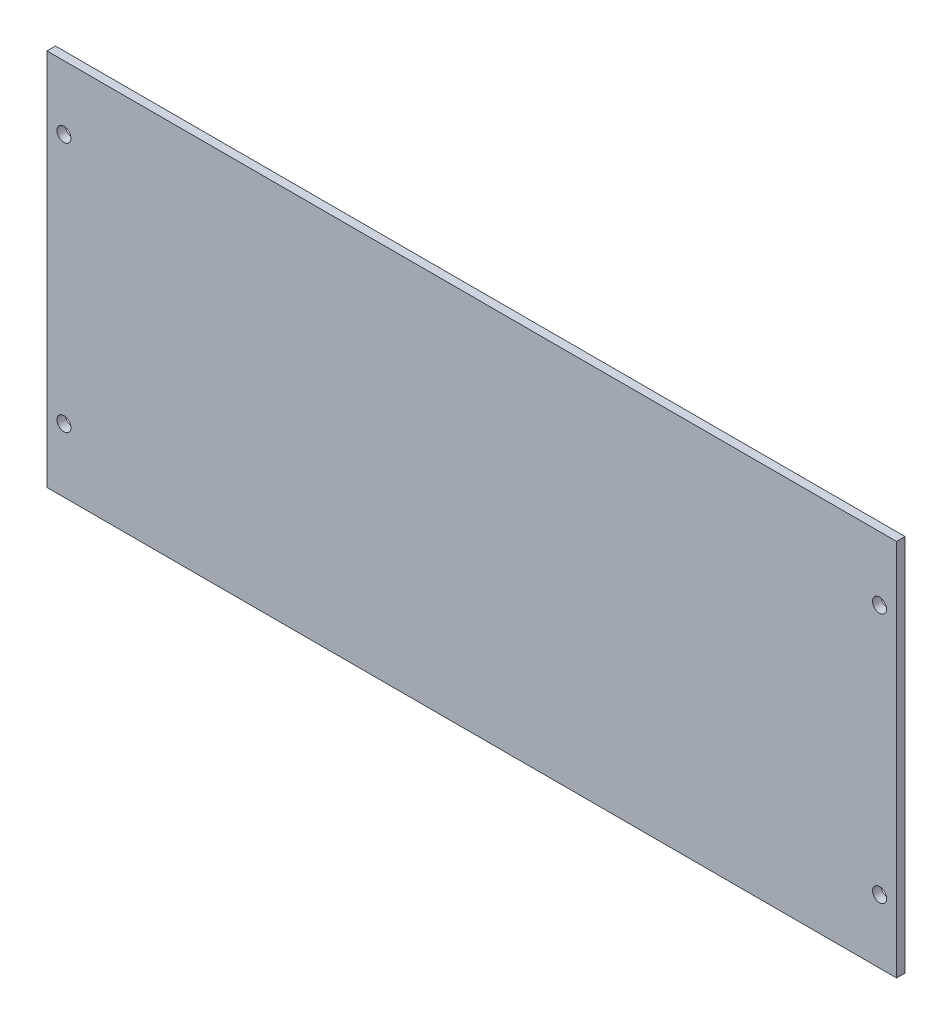
ISO-10303-21;
HEADER;
FILE_DESCRIPTION(('STEP AP214'),'2;1');
FILE_NAME('part.step','',(''),(''),'','','');
FILE_SCHEMA(('AUTOMOTIVE_DESIGN { 1 0 10303 214 1 1 1 1 }'));
ENDSEC;
DATA;
#1=APPLICATION_CONTEXT('core data for automotive mechanical design processes');
#2=APPLICATION_PROTOCOL_DEFINITION('international standard','automotive_design',2000,#1);
#3=PRODUCT_CONTEXT('',#1,'mechanical');
#4=PRODUCT('Part','Part','',(#3));
#5=PRODUCT_RELATED_PRODUCT_CATEGORY('part','',(#4));
#6=PRODUCT_DEFINITION_FORMATION('','',#4);
#7=PRODUCT_DEFINITION_CONTEXT('part definition',#1,'design');
#8=PRODUCT_DEFINITION('design','',#6,#7);
#9=PRODUCT_DEFINITION_SHAPE('','',#8);
#10=(LENGTH_UNIT() NAMED_UNIT(*) SI_UNIT(.MILLI.,.METRE.));
#11=(NAMED_UNIT(*) PLANE_ANGLE_UNIT() SI_UNIT($,.RADIAN.));
#12=(NAMED_UNIT(*) SI_UNIT($,.STERADIAN.) SOLID_ANGLE_UNIT());
#13=UNCERTAINTY_MEASURE_WITH_UNIT(LENGTH_MEASURE(1.E-05),#10,'distance_accuracy_value','');
#14=(GEOMETRIC_REPRESENTATION_CONTEXT(3) GLOBAL_UNCERTAINTY_ASSIGNED_CONTEXT((#13)) GLOBAL_UNIT_ASSIGNED_CONTEXT((#10,
#11,#12)) REPRESENTATION_CONTEXT('',''));
#15=CARTESIAN_POINT('',(0.,0.,0.));
#16=DIRECTION('',(0.,0.,1.));
#17=DIRECTION('',(1.,0.,0.));
#18=AXIS2_PLACEMENT_3D('',#15,#16,#17);
#19=CARTESIAN_POINT('',(200.,-89.,4.));
#20=DIRECTION('',(-1.,0.,0.));
#21=DIRECTION('',(0.,0.,1.));
#22=AXIS2_PLACEMENT_3D('',#19,#20,#21);
#23=PLANE('',#22);
#24=DIRECTION('',(0.,1.,0.));
#25=VECTOR('',#24,1.);
#26=CARTESIAN_POINT('',(200.,-89.,0.));
#27=LINE('',#26,#25);
#28=CARTESIAN_POINT('',(200.,-89.,0.));
#29=VERTEX_POINT('',#28);
#30=CARTESIAN_POINT('',(200.,89.,0.));
#31=VERTEX_POINT('',#30);
#32=EDGE_CURVE('E95',#29,#31,#27,.T.);
#33=ORIENTED_EDGE('',*,*,#32,.T.);
#34=DIRECTION('',(0.,0.,-1.));
#35=VECTOR('',#34,1.);
#36=CARTESIAN_POINT('',(200.,89.,4.));
#37=LINE('',#36,#35);
#38=CARTESIAN_POINT('',(200.,89.,4.));
#39=VERTEX_POINT('',#38);
#40=EDGE_CURVE('E11',#39,#31,#37,.T.);
#41=ORIENTED_EDGE('',*,*,#40,.F.);
#42=DIRECTION('',(0.,1.,0.));
#43=VECTOR('',#42,1.);
#44=CARTESIAN_POINT('',(200.,-89.,4.));
#45=LINE('',#44,#43);
#46=CARTESIAN_POINT('',(200.,-89.,4.));
#47=VERTEX_POINT('',#46);
#48=EDGE_CURVE('E83',#47,#39,#45,.T.);
#49=ORIENTED_EDGE('',*,*,#48,.F.);
#50=DIRECTION('',(0.,0.,-1.));
#51=VECTOR('',#50,1.);
#52=CARTESIAN_POINT('',(200.,-89.,4.));
#53=LINE('',#52,#51);
#54=EDGE_CURVE('E91',#47,#29,#53,.T.);
#55=ORIENTED_EDGE('',*,*,#54,.T.);
#56=EDGE_LOOP('',(#33,#41,#49,#55));
#57=FACE_BOUND('',#56,.T.);
#58=ADVANCED_FACE('F32',(#57),#23,.F.);
#59=CARTESIAN_POINT('',(-200.,89.,4.));
#60=DIRECTION('',(0.,-1.,0.));
#61=DIRECTION('',(0.,0.,-1.));
#62=AXIS2_PLACEMENT_3D('',#59,#60,#61);
#63=PLANE('',#62);
#64=DIRECTION('',(-1.,0.,0.));
#65=VECTOR('',#64,1.);
#66=CARTESIAN_POINT('',(-200.,89.,0.));
#67=LINE('',#66,#65);
#68=CARTESIAN_POINT('',(-200.,89.,0.));
#69=VERTEX_POINT('',#68);
#70=EDGE_CURVE('E87',#31,#69,#67,.T.);
#71=ORIENTED_EDGE('',*,*,#70,.T.);
#72=DIRECTION('',(0.,0.,-1.));
#73=VECTOR('',#72,1.);
#74=CARTESIAN_POINT('',(-200.,89.,4.));
#75=LINE('',#74,#73);
#76=CARTESIAN_POINT('',(-200.,89.,4.));
#77=VERTEX_POINT('',#76);
#78=EDGE_CURVE('E40',#77,#69,#75,.T.);
#79=ORIENTED_EDGE('',*,*,#78,.F.);
#80=DIRECTION('',(-1.,0.,0.));
#81=VECTOR('',#80,1.);
#82=CARTESIAN_POINT('',(-200.,89.,4.));
#83=LINE('',#82,#81);
#84=EDGE_CURVE('E78',#39,#77,#83,.T.);
#85=ORIENTED_EDGE('',*,*,#84,.F.);
#86=ORIENTED_EDGE('',*,*,#40,.T.);
#87=EDGE_LOOP('',(#71,#79,#85,#86));
#88=FACE_BOUND('',#87,.T.);
#89=ADVANCED_FACE('F86',(#88),#63,.F.);
#90=CARTESIAN_POINT('',(-200.,-89.,4.));
#91=DIRECTION('',(1.,0.,0.));
#92=DIRECTION('',(0.,0.,-1.));
#93=AXIS2_PLACEMENT_3D('',#90,#91,#92);
#94=PLANE('',#93);
#95=DIRECTION('',(0.,-1.,0.));
#96=VECTOR('',#95,1.);
#97=CARTESIAN_POINT('',(-200.,-89.,0.));
#98=LINE('',#97,#96);
#99=CARTESIAN_POINT('',(-200.,-89.,0.));
#100=VERTEX_POINT('',#99);
#101=EDGE_CURVE('E65',#69,#100,#98,.T.);
#102=ORIENTED_EDGE('',*,*,#101,.T.);
#103=DIRECTION('',(0.,0.,-1.));
#104=VECTOR('',#103,1.);
#105=CARTESIAN_POINT('',(-200.,-89.,4.));
#106=LINE('',#105,#104);
#107=CARTESIAN_POINT('',(-200.,-89.,4.));
#108=VERTEX_POINT('',#107);
#109=EDGE_CURVE('E88',#108,#100,#106,.T.);
#110=ORIENTED_EDGE('',*,*,#109,.F.);
#111=DIRECTION('',(0.,-1.,0.));
#112=VECTOR('',#111,1.);
#113=CARTESIAN_POINT('',(-200.,-89.,4.));
#114=LINE('',#113,#112);
#115=EDGE_CURVE('E81',#77,#108,#114,.T.);
#116=ORIENTED_EDGE('',*,*,#115,.F.);
#117=ORIENTED_EDGE('',*,*,#78,.T.);
#118=EDGE_LOOP('',(#102,#110,#116,#117));
#119=FACE_BOUND('',#118,.T.);
#120=ADVANCED_FACE('F89',(#119),#94,.F.);
#121=CARTESIAN_POINT('',(-200.,-89.,4.));
#122=DIRECTION('',(0.,1.,0.));
#123=DIRECTION('',(0.,0.,1.));
#124=AXIS2_PLACEMENT_3D('',#121,#122,#123);
#125=PLANE('',#124);
#126=DIRECTION('',(1.,0.,0.));
#127=VECTOR('',#126,1.);
#128=CARTESIAN_POINT('',(-200.,-89.,0.));
#129=LINE('',#128,#127);
#130=EDGE_CURVE('E71',#100,#29,#129,.T.);
#131=ORIENTED_EDGE('',*,*,#130,.T.);
#132=ORIENTED_EDGE('',*,*,#54,.F.);
#133=DIRECTION('',(1.,0.,0.));
#134=VECTOR('',#133,1.);
#135=CARTESIAN_POINT('',(-200.,-89.,4.));
#136=LINE('',#135,#134);
#137=EDGE_CURVE('E48',#108,#47,#136,.T.);
#138=ORIENTED_EDGE('',*,*,#137,.F.);
#139=ORIENTED_EDGE('',*,*,#109,.T.);
#140=EDGE_LOOP('',(#131,#132,#138,#139));
#141=FACE_BOUND('',#140,.T.);
#142=ADVANCED_FACE('F103',(#141),#125,.F.);
#143=CARTESIAN_POINT('',(0.,0.,4.));
#144=DIRECTION('',(0.,0.,-1.));
#145=DIRECTION('',(-1.,0.,0.));
#146=AXIS2_PLACEMENT_3D('',#143,#144,#145);
#147=PLANE('',#146);
#148=CARTESIAN_POINT('',(-192.,59.,4.));
#149=DIRECTION('',(0.,0.,-1.));
#150=DIRECTION('',(-1.,0.,0.));
#151=AXIS2_PLACEMENT_3D('',#148,#149,#150);
#152=CIRCLE('',#151,3.3);
#153=CARTESIAN_POINT('',(-195.3,59.,4.));
#154=VERTEX_POINT('',#153);
#155=EDGE_CURVE('E126',#154,#154,#152,.T.);
#156=ORIENTED_EDGE('',*,*,#155,.T.);
#157=EDGE_LOOP('',(#156));
#158=FACE_BOUND('',#157,.T.);
#159=CARTESIAN_POINT('',(-192.,-59.,4.));
#160=DIRECTION('',(0.,0.,-1.));
#161=DIRECTION('',(-1.,0.,0.));
#162=AXIS2_PLACEMENT_3D('',#159,#160,#161);
#163=CIRCLE('',#162,3.3);
#164=CARTESIAN_POINT('',(-195.3,-59.,4.));
#165=VERTEX_POINT('',#164);
#166=EDGE_CURVE('E120',#165,#165,#163,.T.);
#167=ORIENTED_EDGE('',*,*,#166,.T.);
#168=EDGE_LOOP('',(#167));
#169=FACE_BOUND('',#168,.T.);
#170=CARTESIAN_POINT('',(192.,-59.,4.));
#171=DIRECTION('',(0.,0.,-1.));
#172=DIRECTION('',(-1.,0.,0.));
#173=AXIS2_PLACEMENT_3D('',#170,#171,#172);
#174=CIRCLE('',#173,3.3);
#175=CARTESIAN_POINT('',(188.7,-59.,4.));
#176=VERTEX_POINT('',#175);
#177=EDGE_CURVE('E114',#176,#176,#174,.T.);
#178=ORIENTED_EDGE('',*,*,#177,.T.);
#179=EDGE_LOOP('',(#178));
#180=FACE_BOUND('',#179,.T.);
#181=CARTESIAN_POINT('',(192.,59.,4.));
#182=DIRECTION('',(0.,0.,-1.));
#183=DIRECTION('',(-1.,0.,0.));
#184=AXIS2_PLACEMENT_3D('',#181,#182,#183);
#185=CIRCLE('',#184,3.3);
#186=CARTESIAN_POINT('',(188.7,59.,4.));
#187=VERTEX_POINT('',#186);
#188=EDGE_CURVE('E98',#187,#187,#185,.T.);
#189=ORIENTED_EDGE('',*,*,#188,.T.);
#190=EDGE_LOOP('',(#189));
#191=FACE_BOUND('',#190,.T.);
#192=ORIENTED_EDGE('',*,*,#48,.T.);
#193=ORIENTED_EDGE('',*,*,#84,.T.);
#194=ORIENTED_EDGE('',*,*,#115,.T.);
#195=ORIENTED_EDGE('',*,*,#137,.T.);
#196=EDGE_LOOP('',(#192,#193,#194,#195));
#197=FACE_BOUND('',#196,.T.);
#198=ADVANCED_FACE('F79',(#158,#169,#180,#191,#197),#147,.F.);
#199=CARTESIAN_POINT('',(0.,0.,0.));
#200=DIRECTION('',(0.,0.,-1.));
#201=DIRECTION('',(-1.,0.,0.));
#202=AXIS2_PLACEMENT_3D('',#199,#200,#201);
#203=PLANE('',#202);
#204=CARTESIAN_POINT('',(-192.,59.,0.));
#205=DIRECTION('',(0.,0.,-1.));
#206=DIRECTION('',(-1.,0.,0.));
#207=AXIS2_PLACEMENT_3D('',#204,#205,#206);
#208=CIRCLE('',#207,3.3);
#209=CARTESIAN_POINT('',(-195.3,59.,0.));
#210=VERTEX_POINT('',#209);
#211=EDGE_CURVE('E129',#210,#210,#208,.T.);
#212=ORIENTED_EDGE('',*,*,#211,.F.);
#213=EDGE_LOOP('',(#212));
#214=FACE_BOUND('',#213,.T.);
#215=CARTESIAN_POINT('',(-192.,-59.,0.));
#216=DIRECTION('',(0.,0.,-1.));
#217=DIRECTION('',(-1.,0.,0.));
#218=AXIS2_PLACEMENT_3D('',#215,#216,#217);
#219=CIRCLE('',#218,3.3);
#220=CARTESIAN_POINT('',(-195.3,-59.,0.));
#221=VERTEX_POINT('',#220);
#222=EDGE_CURVE('E123',#221,#221,#219,.T.);
#223=ORIENTED_EDGE('',*,*,#222,.F.);
#224=EDGE_LOOP('',(#223));
#225=FACE_BOUND('',#224,.T.);
#226=CARTESIAN_POINT('',(192.,-59.,0.));
#227=DIRECTION('',(0.,0.,-1.));
#228=DIRECTION('',(-1.,0.,0.));
#229=AXIS2_PLACEMENT_3D('',#226,#227,#228);
#230=CIRCLE('',#229,3.3);
#231=CARTESIAN_POINT('',(188.7,-59.,0.));
#232=VERTEX_POINT('',#231);
#233=EDGE_CURVE('E117',#232,#232,#230,.T.);
#234=ORIENTED_EDGE('',*,*,#233,.F.);
#235=EDGE_LOOP('',(#234));
#236=FACE_BOUND('',#235,.T.);
#237=CARTESIAN_POINT('',(192.,59.,0.));
#238=DIRECTION('',(0.,0.,-1.));
#239=DIRECTION('',(-1.,0.,0.));
#240=AXIS2_PLACEMENT_3D('',#237,#238,#239);
#241=CIRCLE('',#240,3.3);
#242=CARTESIAN_POINT('',(188.7,59.,0.));
#243=VERTEX_POINT('',#242);
#244=EDGE_CURVE('E111',#243,#243,#241,.T.);
#245=ORIENTED_EDGE('',*,*,#244,.F.);
#246=EDGE_LOOP('',(#245));
#247=FACE_BOUND('',#246,.T.);
#248=ORIENTED_EDGE('',*,*,#32,.F.);
#249=ORIENTED_EDGE('',*,*,#130,.F.);
#250=ORIENTED_EDGE('',*,*,#101,.F.);
#251=ORIENTED_EDGE('',*,*,#70,.F.);
#252=EDGE_LOOP('',(#248,#249,#250,#251));
#253=FACE_BOUND('',#252,.T.);
#254=ADVANCED_FACE('F106',(#214,#225,#236,#247,#253),#203,.T.);
#255=CARTESIAN_POINT('',(192.,59.,0.));
#256=DIRECTION('',(0.,0.,-1.));
#257=DIRECTION('',(-1.,0.,0.));
#258=AXIS2_PLACEMENT_3D('',#255,#256,#257);
#259=CYLINDRICAL_SURFACE('',#258,3.3);
#260=ORIENTED_EDGE('',*,*,#188,.F.);
#261=EDGE_LOOP('',(#260));
#262=FACE_BOUND('',#261,.T.);
#263=ORIENTED_EDGE('',*,*,#244,.T.);
#264=EDGE_LOOP('',(#263));
#265=FACE_BOUND('',#264,.T.);
#266=ADVANCED_FACE('F137',(#262,#265),#259,.F.);
#267=CARTESIAN_POINT('',(192.,-59.,0.));
#268=DIRECTION('',(0.,0.,-1.));
#269=DIRECTION('',(-1.,0.,0.));
#270=AXIS2_PLACEMENT_3D('',#267,#268,#269);
#271=CYLINDRICAL_SURFACE('',#270,3.3);
#272=ORIENTED_EDGE('',*,*,#177,.F.);
#273=EDGE_LOOP('',(#272));
#274=FACE_BOUND('',#273,.T.);
#275=ORIENTED_EDGE('',*,*,#233,.T.);
#276=EDGE_LOOP('',(#275));
#277=FACE_BOUND('',#276,.T.);
#278=ADVANCED_FACE('F146',(#274,#277),#271,.F.);
#279=CARTESIAN_POINT('',(-192.,-59.,0.));
#280=DIRECTION('',(0.,0.,-1.));
#281=DIRECTION('',(-1.,0.,0.));
#282=AXIS2_PLACEMENT_3D('',#279,#280,#281);
#283=CYLINDRICAL_SURFACE('',#282,3.3);
#284=ORIENTED_EDGE('',*,*,#166,.F.);
#285=EDGE_LOOP('',(#284));
#286=FACE_BOUND('',#285,.T.);
#287=ORIENTED_EDGE('',*,*,#222,.T.);
#288=EDGE_LOOP('',(#287));
#289=FACE_BOUND('',#288,.T.);
#290=ADVANCED_FACE('F152',(#286,#289),#283,.F.);
#291=CARTESIAN_POINT('',(-192.,59.,0.));
#292=DIRECTION('',(0.,0.,-1.));
#293=DIRECTION('',(-1.,0.,0.));
#294=AXIS2_PLACEMENT_3D('',#291,#292,#293);
#295=CYLINDRICAL_SURFACE('',#294,3.3);
#296=ORIENTED_EDGE('',*,*,#155,.F.);
#297=EDGE_LOOP('',(#296));
#298=FACE_BOUND('',#297,.T.);
#299=ORIENTED_EDGE('',*,*,#211,.T.);
#300=EDGE_LOOP('',(#299));
#301=FACE_BOUND('',#300,.T.);
#302=ADVANCED_FACE('F133',(#298,#301),#295,.F.);
#303=CLOSED_SHELL('',(#58,#89,#120,#142,#198,#254,#266,#278,#290,#302));
#304=MANIFOLD_SOLID_BREP('B2',#303);
#305=ADVANCED_BREP_SHAPE_REPRESENTATION('',(#18,#304),#14);
#306=SHAPE_DEFINITION_REPRESENTATION(#9,#305);
ENDSEC;
END-ISO-10303-21;
